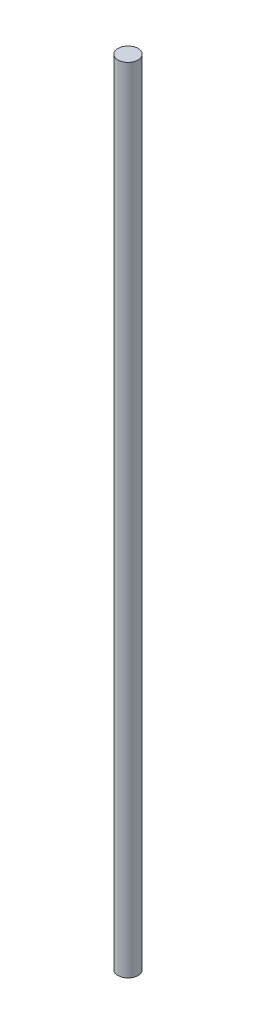
ISO-10303-21;
HEADER;
FILE_DESCRIPTION(('STEP AP214'),'2;1');
FILE_NAME('part.step','',(''),(''),'','','');
FILE_SCHEMA(('AUTOMOTIVE_DESIGN { 1 0 10303 214 1 1 1 1 }'));
ENDSEC;
DATA;
#1=APPLICATION_CONTEXT('core data for automotive mechanical design processes');
#2=APPLICATION_PROTOCOL_DEFINITION('international standard','automotive_design',2000,#1);
#3=PRODUCT_CONTEXT('',#1,'mechanical');
#4=PRODUCT('Part','Part','',(#3));
#5=PRODUCT_RELATED_PRODUCT_CATEGORY('part','',(#4));
#6=PRODUCT_DEFINITION_FORMATION('','',#4);
#7=PRODUCT_DEFINITION_CONTEXT('part definition',#1,'design');
#8=PRODUCT_DEFINITION('design','',#6,#7);
#9=PRODUCT_DEFINITION_SHAPE('','',#8);
#10=(LENGTH_UNIT() NAMED_UNIT(*) SI_UNIT(.MILLI.,.METRE.));
#11=(NAMED_UNIT(*) PLANE_ANGLE_UNIT() SI_UNIT($,.RADIAN.));
#12=(NAMED_UNIT(*) SI_UNIT($,.STERADIAN.) SOLID_ANGLE_UNIT());
#13=UNCERTAINTY_MEASURE_WITH_UNIT(LENGTH_MEASURE(1.E-05),#10,'distance_accuracy_value','');
#14=(GEOMETRIC_REPRESENTATION_CONTEXT(3) GLOBAL_UNCERTAINTY_ASSIGNED_CONTEXT((#13)) GLOBAL_UNIT_ASSIGNED_CONTEXT((#10,
#11,#12)) REPRESENTATION_CONTEXT('',''));
#15=CARTESIAN_POINT('',(0.,0.,0.));
#16=DIRECTION('',(0.,0.,1.));
#17=DIRECTION('',(1.,0.,0.));
#18=AXIS2_PLACEMENT_3D('',#15,#16,#17);
#19=CARTESIAN_POINT('',(-61.6435619918826,790.,0.));
#20=DIRECTION('',(0.,-1.,0.));
#21=DIRECTION('',(0.,0.,-1.));
#22=AXIS2_PLACEMENT_3D('',#19,#20,#21);
#23=CYLINDRICAL_SURFACE('',#22,10.);
#24=CARTESIAN_POINT('',(-61.6435619918826,790.,0.));
#25=DIRECTION('',(0.,1.,0.));
#26=DIRECTION('',(0.,0.,1.));
#27=AXIS2_PLACEMENT_3D('',#24,#25,#26);
#28=CIRCLE('',#27,10.);
#29=CARTESIAN_POINT('',(-61.6435619918826,790.,-10.));
#30=VERTEX_POINT('',#29);
#31=EDGE_CURVE('E10',#30,#30,#28,.T.);
#32=CARTESIAN_POINT('',(-61.6435619918826,0.,0.));
#33=DIRECTION('',(0.,1.,0.));
#34=DIRECTION('',(0.,0.,1.));
#35=AXIS2_PLACEMENT_3D('',#32,#33,#34);
#36=CIRCLE('',#35,10.);
#37=CARTESIAN_POINT('',(-61.6435619918826,-1.11022302462516E-13,-10.));
#38=VERTEX_POINT('',#37);
#39=EDGE_CURVE('E40',#38,#38,#36,.T.);
#40=CARTESIAN_POINT('',(-61.6435619918826,790.,-10.));
#41=CARTESIAN_POINT('',(-61.6435619918826,781.770833333333,-10.));
#42=CARTESIAN_POINT('',(-61.6435619918826,773.541666666667,-10.));
#43=CARTESIAN_POINT('',(-61.6435619918826,757.083333333333,-10.));
#44=CARTESIAN_POINT('',(-61.6435619918826,748.854166666667,-10.));
#45=CARTESIAN_POINT('',(-61.6435619918826,732.395833333333,-10.));
#46=CARTESIAN_POINT('',(-61.6435619918826,724.166666666667,-10.));
#47=CARTESIAN_POINT('',(-61.6435619918826,707.708333333333,-10.));
#48=CARTESIAN_POINT('',(-61.6435619918826,699.479166666667,-10.));
#49=CARTESIAN_POINT('',(-61.6435619918826,683.020833333333,-10.));
#50=CARTESIAN_POINT('',(-61.6435619918826,674.791666666667,-10.));
#51=CARTESIAN_POINT('',(-61.6435619918826,658.333333333333,-10.));
#52=CARTESIAN_POINT('',(-61.6435619918826,650.104166666667,-10.));
#53=CARTESIAN_POINT('',(-61.6435619918826,633.645833333333,-10.));
#54=CARTESIAN_POINT('',(-61.6435619918826,625.416666666667,-10.));
#55=CARTESIAN_POINT('',(-61.6435619918826,608.958333333333,-10.));
#56=CARTESIAN_POINT('',(-61.6435619918826,600.729166666667,-10.));
#57=CARTESIAN_POINT('',(-61.6435619918826,584.270833333333,-10.));
#58=CARTESIAN_POINT('',(-61.6435619918826,576.041666666667,-10.));
#59=CARTESIAN_POINT('',(-61.6435619918826,559.583333333333,-10.));
#60=CARTESIAN_POINT('',(-61.6435619918826,551.354166666667,-10.));
#61=CARTESIAN_POINT('',(-61.6435619918826,534.895833333333,-10.));
#62=CARTESIAN_POINT('',(-61.6435619918826,526.666666666667,-10.));
#63=CARTESIAN_POINT('',(-61.6435619918826,510.208333333333,-10.));
#64=CARTESIAN_POINT('',(-61.6435619918826,501.979166666667,-10.));
#65=CARTESIAN_POINT('',(-61.6435619918826,485.520833333333,-10.));
#66=CARTESIAN_POINT('',(-61.6435619918826,477.291666666667,-10.));
#67=CARTESIAN_POINT('',(-61.6435619918826,460.833333333333,-10.));
#68=CARTESIAN_POINT('',(-61.6435619918826,452.604166666667,-10.));
#69=CARTESIAN_POINT('',(-61.6435619918826,436.145833333333,-10.));
#70=CARTESIAN_POINT('',(-61.6435619918826,427.916666666667,-10.));
#71=CARTESIAN_POINT('',(-61.6435619918826,411.458333333333,-10.));
#72=CARTESIAN_POINT('',(-61.6435619918826,403.229166666667,-10.));
#73=CARTESIAN_POINT('',(-61.6435619918826,386.770833333333,-10.));
#74=CARTESIAN_POINT('',(-61.6435619918826,378.541666666667,-10.));
#75=CARTESIAN_POINT('',(-61.6435619918826,362.083333333333,-10.));
#76=CARTESIAN_POINT('',(-61.6435619918826,353.854166666667,-10.));
#77=CARTESIAN_POINT('',(-61.6435619918826,337.395833333333,-10.));
#78=CARTESIAN_POINT('',(-61.6435619918826,329.166666666667,-10.));
#79=CARTESIAN_POINT('',(-61.6435619918826,312.708333333333,-10.));
#80=CARTESIAN_POINT('',(-61.6435619918826,304.479166666667,-10.));
#81=CARTESIAN_POINT('',(-61.6435619918826,288.020833333333,-10.));
#82=CARTESIAN_POINT('',(-61.6435619918826,279.791666666667,-10.));
#83=CARTESIAN_POINT('',(-61.6435619918826,263.333333333333,-10.));
#84=CARTESIAN_POINT('',(-61.6435619918826,255.104166666667,-10.));
#85=CARTESIAN_POINT('',(-61.6435619918826,238.645833333333,-10.));
#86=CARTESIAN_POINT('',(-61.6435619918826,230.416666666667,-10.));
#87=CARTESIAN_POINT('',(-61.6435619918826,213.958333333333,-10.));
#88=CARTESIAN_POINT('',(-61.6435619918826,205.729166666667,-10.));
#89=CARTESIAN_POINT('',(-61.6435619918826,189.270833333333,-10.));
#90=CARTESIAN_POINT('',(-61.6435619918826,181.041666666667,-10.));
#91=CARTESIAN_POINT('',(-61.6435619918826,164.583333333333,-10.));
#92=CARTESIAN_POINT('',(-61.6435619918826,156.354166666667,-10.));
#93=CARTESIAN_POINT('',(-61.6435619918826,139.895833333333,-10.));
#94=CARTESIAN_POINT('',(-61.6435619918826,131.666666666667,-10.));
#95=CARTESIAN_POINT('',(-61.6435619918826,115.208333333333,-10.));
#96=CARTESIAN_POINT('',(-61.6435619918826,106.979166666667,-10.));
#97=CARTESIAN_POINT('',(-61.6435619918826,90.5208333333332,-10.));
#98=CARTESIAN_POINT('',(-61.6435619918826,82.2916666666666,-10.));
#99=CARTESIAN_POINT('',(-61.6435619918826,65.8333333333333,-10.));
#100=CARTESIAN_POINT('',(-61.6435619918826,57.6041666666666,-10.));
#101=CARTESIAN_POINT('',(-61.6435619918826,41.1458333333333,-10.));
#102=CARTESIAN_POINT('',(-61.6435619918826,32.9166666666666,-10.));
#103=CARTESIAN_POINT('',(-61.6435619918826,16.4583333333332,-10.));
#104=CARTESIAN_POINT('',(-61.6435619918826,8.22916666666655,-10.));
#105=CARTESIAN_POINT('',(-61.6435619918826,-1.11022302462516E-13,-10.));
#106=B_SPLINE_CURVE_WITH_KNOTS('',3,(#40,#41,#42,#43,#44,#45,#46,#47,#48,#49,#50,#51,#52,#53,
#54,#55,#56,#57,#58,#59,#60,#61,#62,#63,#64,#65,#66,#67,#68,#69,#70,#71,#72,#73,#74,#75,#76,#77,
#78,#79,#80,#81,#82,#83,#84,#85,#86,#87,#88,#89,#90,#91,#92,#93,#94,#95,#96,#97,#98,#99,#100,
#101,#102,#103,#104,#105),.UNSPECIFIED.,.F.,.F.,(4,2,2,2,2,2,2,2,2,2,2,2,2,2,2,2,2,2,2,2,2,2,2,
2,2,2,2,2,2,2,2,2,4),(0.,24.6875,49.3749999999999,74.0624999999999,98.75,123.4375,148.125,
172.8125,197.5,222.1875,246.875,271.5625,296.25,320.9375,345.625,370.3125,395.,419.6875,444.375,
469.0625,493.75,518.4375,543.125,567.8125,592.5,617.1875,641.875,666.5625,691.25,715.9375,
740.625,765.3125,790.),.UNSPECIFIED.);
#107=EDGE_CURVE('BSEAM37',#30,#38,#106,.T.);
#108=ORIENTED_EDGE('',*,*,#31,.F.);
#109=ORIENTED_EDGE('',*,*,#39,.T.);
#110=ORIENTED_EDGE('',*,*,#107,.T.);
#111=ORIENTED_EDGE('',*,*,#107,.F.);
#112=EDGE_LOOP('',(#108,#110,#109,#111));
#113=FACE_BOUND('',#112,.T.);
#114=ADVANCED_FACE('F37',(#113),#23,.T.);
#115=CARTESIAN_POINT('',(-61.6435619918826,790.,0.));
#116=DIRECTION('',(0.,1.,0.));
#117=DIRECTION('',(0.,0.,1.));
#118=AXIS2_PLACEMENT_3D('',#115,#116,#117);
#119=PLANE('',#118);
#120=ORIENTED_EDGE('',*,*,#31,.T.);
#121=EDGE_LOOP('',(#120));
#122=FACE_BOUND('',#121,.T.);
#123=ADVANCED_FACE('F54',(#122),#119,.T.);
#124=CARTESIAN_POINT('',(-61.6435619918826,0.,0.));
#125=DIRECTION('',(0.,1.,0.));
#126=DIRECTION('',(0.,0.,1.));
#127=AXIS2_PLACEMENT_3D('',#124,#125,#126);
#128=PLANE('',#127);
#129=ORIENTED_EDGE('',*,*,#39,.F.);
#130=EDGE_LOOP('',(#129));
#131=FACE_BOUND('',#130,.T.);
#132=ADVANCED_FACE('F52',(#131),#128,.F.);
#133=CLOSED_SHELL('',(#114,#123,#132));
#134=MANIFOLD_SOLID_BREP('B2',#133);
#135=ADVANCED_BREP_SHAPE_REPRESENTATION('',(#18,#134),#14);
#136=SHAPE_DEFINITION_REPRESENTATION(#9,#135);
ENDSEC;
END-ISO-10303-21;
